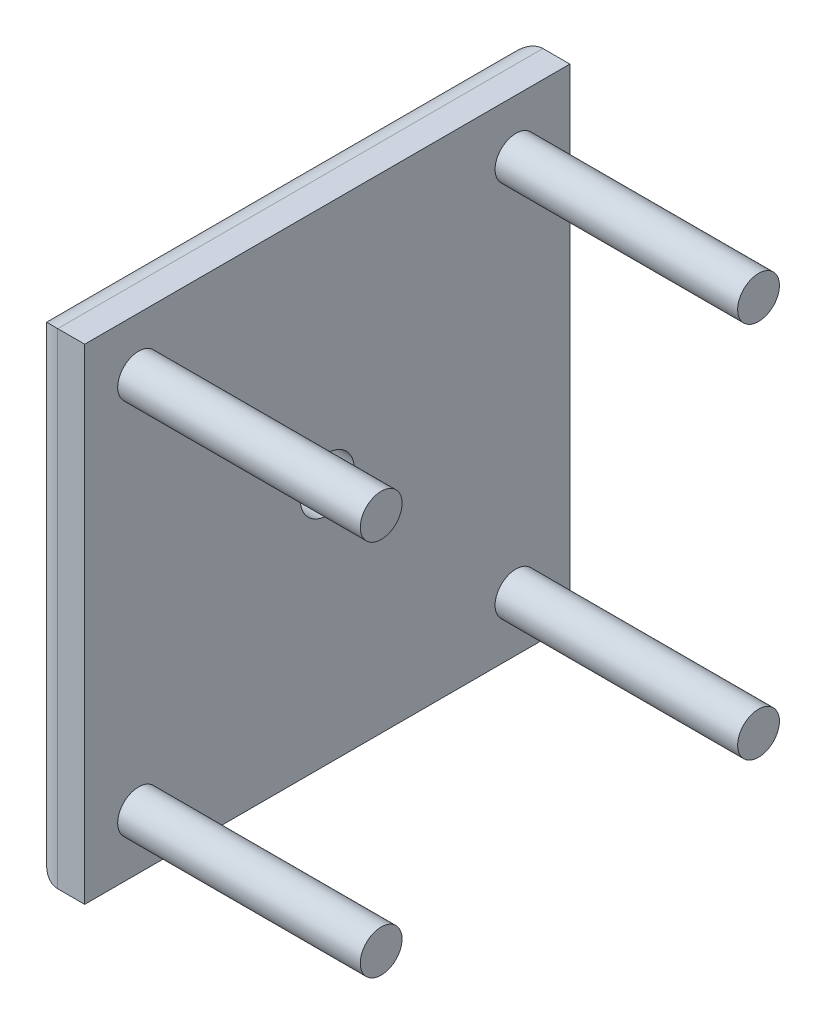
ISO-10303-21;
HEADER;
FILE_DESCRIPTION(('STEP AP214'),'2;1');
FILE_NAME('part.step','',(''),(''),'','','');
FILE_SCHEMA(('AUTOMOTIVE_DESIGN { 1 0 10303 214 1 1 1 1 }'));
ENDSEC;
DATA;
#1=APPLICATION_CONTEXT('core data for automotive mechanical design processes');
#2=APPLICATION_PROTOCOL_DEFINITION('international standard','automotive_design',2000,#1);
#3=PRODUCT_CONTEXT('',#1,'mechanical');
#4=PRODUCT('Part','Part','',(#3));
#5=PRODUCT_RELATED_PRODUCT_CATEGORY('part','',(#4));
#6=PRODUCT_DEFINITION_FORMATION('','',#4);
#7=PRODUCT_DEFINITION_CONTEXT('part definition',#1,'design');
#8=PRODUCT_DEFINITION('design','',#6,#7);
#9=PRODUCT_DEFINITION_SHAPE('','',#8);
#10=(LENGTH_UNIT() NAMED_UNIT(*) SI_UNIT(.MILLI.,.METRE.));
#11=(NAMED_UNIT(*) PLANE_ANGLE_UNIT() SI_UNIT($,.RADIAN.));
#12=(NAMED_UNIT(*) SI_UNIT($,.STERADIAN.) SOLID_ANGLE_UNIT());
#13=UNCERTAINTY_MEASURE_WITH_UNIT(LENGTH_MEASURE(1.E-05),#10,'distance_accuracy_value','');
#14=(GEOMETRIC_REPRESENTATION_CONTEXT(3) GLOBAL_UNCERTAINTY_ASSIGNED_CONTEXT((#13)) GLOBAL_UNIT_ASSIGNED_CONTEXT((#10,
#11,#12)) REPRESENTATION_CONTEXT('',''));
#15=CARTESIAN_POINT('',(0.,0.,0.));
#16=DIRECTION('',(0.,0.,1.));
#17=DIRECTION('',(1.,0.,0.));
#18=AXIS2_PLACEMENT_3D('',#15,#16,#17);
#19=CARTESIAN_POINT('',(2.,0.,0.));
#20=DIRECTION('',(1.,0.,0.));
#21=DIRECTION('',(0.,0.,-1.));
#22=AXIS2_PLACEMENT_3D('',#19,#20,#21);
#23=PLANE('',#22);
#24=CARTESIAN_POINT('',(2.,0.,0.));
#25=DIRECTION('',(1.,0.,0.));
#26=DIRECTION('',(0.,0.,-1.));
#27=AXIS2_PLACEMENT_3D('',#24,#25,#26);
#28=CIRCLE('',#27,1.);
#29=CARTESIAN_POINT('',(2.,0.,-1.));
#30=VERTEX_POINT('',#29);
#31=EDGE_CURVE('E220',#30,#30,#28,.T.);
#32=ORIENTED_EDGE('',*,*,#31,.F.);
#33=EDGE_LOOP('',(#32));
#34=FACE_BOUND('',#33,.T.);
#35=CARTESIAN_POINT('',(2.,7.,-7.));
#36=DIRECTION('',(1.,0.,0.));
#37=DIRECTION('',(0.,0.,-1.));
#38=AXIS2_PLACEMENT_3D('',#35,#36,#37);
#39=CIRCLE('',#38,0.775);
#40=CARTESIAN_POINT('',(2.,7.,-7.775));
#41=VERTEX_POINT('',#40);
#42=EDGE_CURVE('E229',#41,#41,#39,.T.);
#43=ORIENTED_EDGE('',*,*,#42,.F.);
#44=EDGE_LOOP('',(#43));
#45=FACE_BOUND('',#44,.T.);
#46=CARTESIAN_POINT('',(2.,-7.,7.));
#47=DIRECTION('',(1.,0.,0.));
#48=DIRECTION('',(0.,0.,-1.));
#49=AXIS2_PLACEMENT_3D('',#46,#47,#48);
#50=CIRCLE('',#49,0.775);
#51=CARTESIAN_POINT('',(2.,-7.,6.225));
#52=VERTEX_POINT('',#51);
#53=EDGE_CURVE('E237',#52,#52,#50,.T.);
#54=ORIENTED_EDGE('',*,*,#53,.F.);
#55=EDGE_LOOP('',(#54));
#56=FACE_BOUND('',#55,.T.);
#57=CARTESIAN_POINT('',(2.,-7.,-7.));
#58=DIRECTION('',(1.,0.,0.));
#59=DIRECTION('',(0.,0.,-1.));
#60=AXIS2_PLACEMENT_3D('',#57,#58,#59);
#61=CIRCLE('',#60,0.775);
#62=CARTESIAN_POINT('',(2.,-7.,-7.775));
#63=VERTEX_POINT('',#62);
#64=EDGE_CURVE('E245',#63,#63,#61,.T.);
#65=ORIENTED_EDGE('',*,*,#64,.F.);
#66=EDGE_LOOP('',(#65));
#67=FACE_BOUND('',#66,.T.);
#68=CARTESIAN_POINT('',(2.,7.,7.));
#69=DIRECTION('',(1.,0.,0.));
#70=DIRECTION('',(0.,0.,-1.));
#71=AXIS2_PLACEMENT_3D('',#68,#69,#70);
#72=CIRCLE('',#71,0.775);
#73=CARTESIAN_POINT('',(2.,7.,6.225));
#74=VERTEX_POINT('',#73);
#75=EDGE_CURVE('E249',#74,#74,#72,.T.);
#76=ORIENTED_EDGE('',*,*,#75,.F.);
#77=EDGE_LOOP('',(#76));
#78=FACE_BOUND('',#77,.T.);
#79=DIRECTION('',(0.,0.,-1.));
#80=VECTOR('',#79,1.);
#81=CARTESIAN_POINT('',(2.,-9.,0.));
#82=LINE('',#81,#80);
#83=CARTESIAN_POINT('',(2.,-9.,9.));
#84=VERTEX_POINT('',#83);
#85=CARTESIAN_POINT('',(2.,-9.,-9.));
#86=VERTEX_POINT('',#85);
#87=EDGE_CURVE('E158',#84,#86,#82,.T.);
#88=ORIENTED_EDGE('',*,*,#87,.T.);
#89=DIRECTION('',(0.,1.,0.));
#90=VECTOR('',#89,1.);
#91=CARTESIAN_POINT('',(2.,0.,-9.));
#92=LINE('',#91,#90);
#93=CARTESIAN_POINT('',(2.,9.,-9.));
#94=VERTEX_POINT('',#93);
#95=EDGE_CURVE('E147',#86,#94,#92,.T.);
#96=ORIENTED_EDGE('',*,*,#95,.T.);
#97=DIRECTION('',(0.,0.,-1.));
#98=VECTOR('',#97,1.);
#99=CARTESIAN_POINT('',(2.,9.,0.));
#100=LINE('',#99,#98);
#101=CARTESIAN_POINT('',(2.,9.,9.));
#102=VERTEX_POINT('',#101);
#103=EDGE_CURVE('E157',#102,#94,#100,.T.);
#104=ORIENTED_EDGE('',*,*,#103,.F.);
#105=DIRECTION('',(0.,1.,0.));
#106=VECTOR('',#105,1.);
#107=CARTESIAN_POINT('',(2.,0.,9.));
#108=LINE('',#107,#106);
#109=EDGE_CURVE('E163',#84,#102,#108,.T.);
#110=ORIENTED_EDGE('',*,*,#109,.F.);
#111=EDGE_LOOP('',(#88,#96,#104,#110));
#112=FACE_BOUND('',#111,.T.);
#113=ADVANCED_FACE('F95',(#34,#45,#56,#67,#78,#112),#23,.T.);
#114=CARTESIAN_POINT('',(0.,0.,0.));
#115=DIRECTION('',(1.,0.,0.));
#116=DIRECTION('',(0.,0.,-1.));
#117=AXIS2_PLACEMENT_3D('',#114,#115,#116);
#118=PLANE('',#117);
#119=DIRECTION('',(0.,1.,0.));
#120=VECTOR('',#119,1.);
#121=CARTESIAN_POINT('',(0.,0.,-8.));
#122=LINE('',#121,#120);
#123=CARTESIAN_POINT('',(0.,8.,-8.));
#124=VERTEX_POINT('',#123);
#125=CARTESIAN_POINT('',(0.,-8.,-8.));
#126=VERTEX_POINT('',#125);
#127=EDGE_CURVE('E185',#124,#126,#122,.F.);
#128=ORIENTED_EDGE('',*,*,#127,.T.);
#129=DIRECTION('',(0.,0.,-1.));
#130=VECTOR('',#129,1.);
#131=CARTESIAN_POINT('',(0.,-8.,0.));
#132=LINE('',#131,#130);
#133=CARTESIAN_POINT('',(0.,-8.,8.));
#134=VERTEX_POINT('',#133);
#135=EDGE_CURVE('E191',#126,#134,#132,.F.);
#136=ORIENTED_EDGE('',*,*,#135,.T.);
#137=DIRECTION('',(0.,1.,0.));
#138=VECTOR('',#137,1.);
#139=CARTESIAN_POINT('',(0.,9.,8.));
#140=LINE('',#139,#138);
#141=CARTESIAN_POINT('',(0.,8.,8.));
#142=VERTEX_POINT('',#141);
#143=EDGE_CURVE('E188',#134,#142,#140,.T.);
#144=ORIENTED_EDGE('',*,*,#143,.T.);
#145=DIRECTION('',(0.,0.,-1.));
#146=VECTOR('',#145,1.);
#147=CARTESIAN_POINT('',(0.,8.,-9.));
#148=LINE('',#147,#146);
#149=EDGE_CURVE('E177',#142,#124,#148,.T.);
#150=ORIENTED_EDGE('',*,*,#149,.T.);
#151=EDGE_LOOP('',(#128,#136,#144,#150));
#152=FACE_BOUND('',#151,.T.);
#153=CARTESIAN_POINT('',(0.,0.,0.));
#154=DIRECTION('',(-1.,0.,0.));
#155=DIRECTION('',(0.,0.,1.));
#156=AXIS2_PLACEMENT_3D('',#153,#154,#155);
#157=CIRCLE('',#156,1.);
#158=CARTESIAN_POINT('',(0.,0.,1.));
#159=VERTEX_POINT('',#158);
#160=EDGE_CURVE('E213',#159,#159,#157,.T.);
#161=ORIENTED_EDGE('',*,*,#160,.F.);
#162=EDGE_LOOP('',(#161));
#163=FACE_BOUND('',#162,.T.);
#164=ADVANCED_FACE('F284',(#152,#163),#118,.F.);
#165=CARTESIAN_POINT('',(2.,0.,-9.));
#166=DIRECTION('',(0.,0.,1.));
#167=DIRECTION('',(1.,0.,0.));
#168=AXIS2_PLACEMENT_3D('',#165,#166,#167);
#169=PLANE('',#168);
#170=DIRECTION('',(-1.,0.,0.));
#171=VECTOR('',#170,1.);
#172=CARTESIAN_POINT('',(2.,-9.,-9.));
#173=LINE('',#172,#171);
#174=CARTESIAN_POINT('',(1.,-9.,-9.));
#175=VERTEX_POINT('',#174);
#176=EDGE_CURVE('E151',#86,#175,#173,.T.);
#177=ORIENTED_EDGE('',*,*,#176,.T.);
#178=DIRECTION('',(0.,1.,0.));
#179=VECTOR('',#178,1.);
#180=CARTESIAN_POINT('',(1.,0.,-9.));
#181=LINE('',#180,#179);
#182=CARTESIAN_POINT('',(1.,9.,-9.));
#183=VERTEX_POINT('',#182);
#184=EDGE_CURVE('E105',#175,#183,#181,.T.);
#185=ORIENTED_EDGE('',*,*,#184,.T.);
#186=DIRECTION('',(-1.,0.,0.));
#187=VECTOR('',#186,1.);
#188=CARTESIAN_POINT('',(2.,9.,-9.));
#189=LINE('',#188,#187);
#190=EDGE_CURVE('E152',#94,#183,#189,.T.);
#191=ORIENTED_EDGE('',*,*,#190,.F.);
#192=ORIENTED_EDGE('',*,*,#95,.F.);
#193=EDGE_LOOP('',(#177,#185,#191,#192));
#194=FACE_BOUND('',#193,.T.);
#195=ADVANCED_FACE('F149',(#194),#169,.F.);
#196=CARTESIAN_POINT('',(2.,9.,0.));
#197=DIRECTION('',(0.,1.,0.));
#198=DIRECTION('',(0.,0.,1.));
#199=AXIS2_PLACEMENT_3D('',#196,#197,#198);
#200=PLANE('',#199);
#201=ORIENTED_EDGE('',*,*,#190,.T.);
#202=DIRECTION('',(0.,0.,-1.));
#203=VECTOR('',#202,1.);
#204=CARTESIAN_POINT('',(1.,9.,9.));
#205=LINE('',#204,#203);
#206=CARTESIAN_POINT('',(1.,9.,9.));
#207=VERTEX_POINT('',#206);
#208=EDGE_CURVE('E12',#183,#207,#205,.F.);
#209=ORIENTED_EDGE('',*,*,#208,.T.);
#210=DIRECTION('',(-1.,0.,0.));
#211=VECTOR('',#210,1.);
#212=CARTESIAN_POINT('',(2.,9.,9.));
#213=LINE('',#212,#211);
#214=EDGE_CURVE('E179',#102,#207,#213,.T.);
#215=ORIENTED_EDGE('',*,*,#214,.F.);
#216=ORIENTED_EDGE('',*,*,#103,.T.);
#217=EDGE_LOOP('',(#201,#209,#215,#216));
#218=FACE_BOUND('',#217,.T.);
#219=ADVANCED_FACE('F292',(#218),#200,.T.);
#220=CARTESIAN_POINT('',(2.,0.,9.));
#221=DIRECTION('',(0.,0.,1.));
#222=DIRECTION('',(1.,0.,0.));
#223=AXIS2_PLACEMENT_3D('',#220,#221,#222);
#224=PLANE('',#223);
#225=ORIENTED_EDGE('',*,*,#214,.T.);
#226=DIRECTION('',(0.,1.,0.));
#227=VECTOR('',#226,1.);
#228=CARTESIAN_POINT('',(1.,-9.,9.));
#229=LINE('',#228,#227);
#230=CARTESIAN_POINT('',(1.,-9.,9.));
#231=VERTEX_POINT('',#230);
#232=EDGE_CURVE('E195',#207,#231,#229,.F.);
#233=ORIENTED_EDGE('',*,*,#232,.T.);
#234=DIRECTION('',(-1.,0.,0.));
#235=VECTOR('',#234,1.);
#236=CARTESIAN_POINT('',(2.,-9.,9.));
#237=LINE('',#236,#235);
#238=EDGE_CURVE('E263',#84,#231,#237,.T.);
#239=ORIENTED_EDGE('',*,*,#238,.F.);
#240=ORIENTED_EDGE('',*,*,#109,.T.);
#241=EDGE_LOOP('',(#225,#233,#239,#240));
#242=FACE_BOUND('',#241,.T.);
#243=ADVANCED_FACE('F267',(#242),#224,.T.);
#244=CARTESIAN_POINT('',(2.,-9.,0.));
#245=DIRECTION('',(0.,1.,0.));
#246=DIRECTION('',(0.,0.,1.));
#247=AXIS2_PLACEMENT_3D('',#244,#245,#246);
#248=PLANE('',#247);
#249=ORIENTED_EDGE('',*,*,#238,.T.);
#250=DIRECTION('',(0.,0.,-1.));
#251=VECTOR('',#250,1.);
#252=CARTESIAN_POINT('',(1.,-9.,0.));
#253=LINE('',#252,#251);
#254=EDGE_CURVE('E172',#231,#175,#253,.T.);
#255=ORIENTED_EDGE('',*,*,#254,.T.);
#256=ORIENTED_EDGE('',*,*,#176,.F.);
#257=ORIENTED_EDGE('',*,*,#87,.F.);
#258=EDGE_LOOP('',(#249,#255,#256,#257));
#259=FACE_BOUND('',#258,.T.);
#260=ADVANCED_FACE('F170',(#259),#248,.F.);
#261=CARTESIAN_POINT('',(11.,7.,7.));
#262=DIRECTION('',(-1.,0.,0.));
#263=DIRECTION('',(0.,0.,1.));
#264=AXIS2_PLACEMENT_3D('',#261,#262,#263);
#265=CYLINDRICAL_SURFACE('',#264,0.775);
#266=CARTESIAN_POINT('',(11.,7.,7.));
#267=DIRECTION('',(1.,0.,0.));
#268=DIRECTION('',(0.,0.,-1.));
#269=AXIS2_PLACEMENT_3D('',#266,#267,#268);
#270=CIRCLE('',#269,0.775);
#271=CARTESIAN_POINT('',(11.,7.,6.225));
#272=VERTEX_POINT('',#271);
#273=EDGE_CURVE('E167',#272,#272,#270,.T.);
#274=ORIENTED_EDGE('',*,*,#273,.F.);
#275=EDGE_LOOP('',(#274));
#276=FACE_BOUND('',#275,.T.);
#277=ORIENTED_EDGE('',*,*,#75,.T.);
#278=EDGE_LOOP('',(#277));
#279=FACE_BOUND('',#278,.T.);
#280=ADVANCED_FACE('F296',(#276,#279),#265,.T.);
#281=CARTESIAN_POINT('',(11.,0.,0.));
#282=DIRECTION('',(1.,0.,0.));
#283=DIRECTION('',(0.,0.,-1.));
#284=AXIS2_PLACEMENT_3D('',#281,#282,#283);
#285=PLANE('',#284);
#286=ORIENTED_EDGE('',*,*,#273,.T.);
#287=EDGE_LOOP('',(#286));
#288=FACE_BOUND('',#287,.T.);
#289=ADVANCED_FACE('F308',(#288),#285,.T.);
#290=CARTESIAN_POINT('',(11.,-7.,-7.));
#291=DIRECTION('',(-1.,0.,0.));
#292=DIRECTION('',(0.,0.,1.));
#293=AXIS2_PLACEMENT_3D('',#290,#291,#292);
#294=CYLINDRICAL_SURFACE('',#293,0.775);
#295=CARTESIAN_POINT('',(11.,-7.,-7.));
#296=DIRECTION('',(1.,0.,0.));
#297=DIRECTION('',(0.,0.,-1.));
#298=AXIS2_PLACEMENT_3D('',#295,#296,#297);
#299=CIRCLE('',#298,0.775);
#300=CARTESIAN_POINT('',(11.,-7.,-7.775));
#301=VERTEX_POINT('',#300);
#302=EDGE_CURVE('E241',#301,#301,#299,.T.);
#303=ORIENTED_EDGE('',*,*,#302,.F.);
#304=EDGE_LOOP('',(#303));
#305=FACE_BOUND('',#304,.T.);
#306=ORIENTED_EDGE('',*,*,#64,.T.);
#307=EDGE_LOOP('',(#306));
#308=FACE_BOUND('',#307,.T.);
#309=ADVANCED_FACE('F313',(#305,#308),#294,.T.);
#310=CARTESIAN_POINT('',(11.,0.,0.));
#311=DIRECTION('',(1.,0.,0.));
#312=DIRECTION('',(0.,0.,-1.));
#313=AXIS2_PLACEMENT_3D('',#310,#311,#312);
#314=PLANE('',#313);
#315=ORIENTED_EDGE('',*,*,#302,.T.);
#316=EDGE_LOOP('',(#315));
#317=FACE_BOUND('',#316,.T.);
#318=ADVANCED_FACE('F319',(#317),#314,.T.);
#319=CARTESIAN_POINT('',(11.,-7.,7.));
#320=DIRECTION('',(-1.,0.,0.));
#321=DIRECTION('',(0.,0.,1.));
#322=AXIS2_PLACEMENT_3D('',#319,#320,#321);
#323=CYLINDRICAL_SURFACE('',#322,0.775);
#324=CARTESIAN_POINT('',(11.,-7.,7.));
#325=DIRECTION('',(1.,0.,0.));
#326=DIRECTION('',(0.,0.,-1.));
#327=AXIS2_PLACEMENT_3D('',#324,#325,#326);
#328=CIRCLE('',#327,0.775);
#329=CARTESIAN_POINT('',(11.,-7.,6.225));
#330=VERTEX_POINT('',#329);
#331=EDGE_CURVE('E233',#330,#330,#328,.T.);
#332=ORIENTED_EDGE('',*,*,#331,.F.);
#333=EDGE_LOOP('',(#332));
#334=FACE_BOUND('',#333,.T.);
#335=ORIENTED_EDGE('',*,*,#53,.T.);
#336=EDGE_LOOP('',(#335));
#337=FACE_BOUND('',#336,.T.);
#338=ADVANCED_FACE('F322',(#334,#337),#323,.T.);
#339=CARTESIAN_POINT('',(11.,0.,0.));
#340=DIRECTION('',(1.,0.,0.));
#341=DIRECTION('',(0.,0.,-1.));
#342=AXIS2_PLACEMENT_3D('',#339,#340,#341);
#343=PLANE('',#342);
#344=ORIENTED_EDGE('',*,*,#331,.T.);
#345=EDGE_LOOP('',(#344));
#346=FACE_BOUND('',#345,.T.);
#347=ADVANCED_FACE('F327',(#346),#343,.T.);
#348=CARTESIAN_POINT('',(11.,7.,-7.));
#349=DIRECTION('',(-1.,0.,0.));
#350=DIRECTION('',(0.,0.,1.));
#351=AXIS2_PLACEMENT_3D('',#348,#349,#350);
#352=CYLINDRICAL_SURFACE('',#351,0.775);
#353=CARTESIAN_POINT('',(11.,7.,-7.));
#354=DIRECTION('',(1.,0.,0.));
#355=DIRECTION('',(0.,0.,-1.));
#356=AXIS2_PLACEMENT_3D('',#353,#354,#355);
#357=CIRCLE('',#356,0.775);
#358=CARTESIAN_POINT('',(11.,7.,-7.775));
#359=VERTEX_POINT('',#358);
#360=EDGE_CURVE('E226',#359,#359,#357,.T.);
#361=ORIENTED_EDGE('',*,*,#360,.F.);
#362=EDGE_LOOP('',(#361));
#363=FACE_BOUND('',#362,.T.);
#364=ORIENTED_EDGE('',*,*,#42,.T.);
#365=EDGE_LOOP('',(#364));
#366=FACE_BOUND('',#365,.T.);
#367=ADVANCED_FACE('F330',(#363,#366),#352,.T.);
#368=CARTESIAN_POINT('',(11.,7.,-7.));
#369=DIRECTION('',(1.,0.,0.));
#370=DIRECTION('',(0.,0.,-1.));
#371=AXIS2_PLACEMENT_3D('',#368,#369,#370);
#372=PLANE('',#371);
#373=ORIENTED_EDGE('',*,*,#360,.T.);
#374=EDGE_LOOP('',(#373));
#375=FACE_BOUND('',#374,.T.);
#376=ADVANCED_FACE('F335',(#375),#372,.T.);
#377=CARTESIAN_POINT('',(9.,0.,0.));
#378=DIRECTION('',(-1.,0.,0.));
#379=DIRECTION('',(0.,0.,1.));
#380=AXIS2_PLACEMENT_3D('',#377,#378,#379);
#381=CYLINDRICAL_SURFACE('',#380,1.);
#382=ORIENTED_EDGE('',*,*,#31,.T.);
#383=EDGE_LOOP('',(#382));
#384=FACE_BOUND('',#383,.T.);
#385=ORIENTED_EDGE('',*,*,#160,.T.);
#386=EDGE_LOOP('',(#385));
#387=FACE_BOUND('',#386,.T.);
#388=ADVANCED_FACE('F338',(#384,#387),#381,.F.);
#389=CARTESIAN_POINT('',(1.,8.,0.));
#390=DIRECTION('',(0.,0.,1.));
#391=DIRECTION('',(1.,0.,0.));
#392=AXIS2_PLACEMENT_3D('',#389,#390,#391);
#393=CYLINDRICAL_SURFACE('',#392,1.);
#394=CARTESIAN_POINT('',(1.,8.,-8.));
#395=DIRECTION('',(0.,0.707106781186547,0.707106781186547));
#396=DIRECTION('',(0.,-0.707106781186547,0.707106781186547));
#397=AXIS2_PLACEMENT_3D('',#394,#395,#396);
#398=ELLIPSE('',#397,1.41421356237309,1.);
#399=EDGE_CURVE('E205',#124,#183,#398,.F.);
#400=ORIENTED_EDGE('',*,*,#399,.F.);
#401=ORIENTED_EDGE('',*,*,#149,.F.);
#402=CARTESIAN_POINT('',(1.,8.,8.));
#403=DIRECTION('',(0.,-0.707106781186547,0.707106781186547));
#404=DIRECTION('',(0.,0.707106781186547,0.707106781186547));
#405=AXIS2_PLACEMENT_3D('',#402,#403,#404);
#406=ELLIPSE('',#405,1.41421356237309,1.);
#407=EDGE_CURVE('E99',#207,#142,#406,.T.);
#408=ORIENTED_EDGE('',*,*,#407,.F.);
#409=ORIENTED_EDGE('',*,*,#208,.F.);
#410=EDGE_LOOP('',(#400,#401,#408,#409));
#411=FACE_BOUND('',#410,.T.);
#412=ADVANCED_FACE('F97',(#411),#393,.T.);
#413=CARTESIAN_POINT('',(1.,0.,8.));
#414=DIRECTION('',(0.,-1.,0.));
#415=DIRECTION('',(0.,0.,-1.));
#416=AXIS2_PLACEMENT_3D('',#413,#414,#415);
#417=CYLINDRICAL_SURFACE('',#416,1.);
#418=ORIENTED_EDGE('',*,*,#407,.T.);
#419=ORIENTED_EDGE('',*,*,#143,.F.);
#420=CARTESIAN_POINT('',(1.,-8.,8.));
#421=DIRECTION('',(0.,-0.707106781186547,-0.707106781186547));
#422=DIRECTION('',(0.,-0.707106781186547,0.707106781186547));
#423=AXIS2_PLACEMENT_3D('',#420,#421,#422);
#424=ELLIPSE('',#423,1.41421356237309,1.);
#425=EDGE_CURVE('E203',#231,#134,#424,.T.);
#426=ORIENTED_EDGE('',*,*,#425,.F.);
#427=ORIENTED_EDGE('',*,*,#232,.F.);
#428=EDGE_LOOP('',(#418,#419,#426,#427));
#429=FACE_BOUND('',#428,.T.);
#430=ADVANCED_FACE('F271',(#429),#417,.T.);
#431=CARTESIAN_POINT('',(1.,0.,-8.));
#432=DIRECTION('',(0.,1.,0.));
#433=DIRECTION('',(0.,0.,1.));
#434=AXIS2_PLACEMENT_3D('',#431,#432,#433);
#435=CYLINDRICAL_SURFACE('',#434,1.);
#436=ORIENTED_EDGE('',*,*,#399,.T.);
#437=ORIENTED_EDGE('',*,*,#184,.F.);
#438=CARTESIAN_POINT('',(1.,-8.,-8.));
#439=DIRECTION('',(0.,0.707106781186547,-0.707106781186547));
#440=DIRECTION('',(0.,0.707106781186547,0.707106781186547));
#441=AXIS2_PLACEMENT_3D('',#438,#439,#440);
#442=ELLIPSE('',#441,1.41421356237309,1.);
#443=EDGE_CURVE('E200',#126,#175,#442,.F.);
#444=ORIENTED_EDGE('',*,*,#443,.F.);
#445=ORIENTED_EDGE('',*,*,#127,.F.);
#446=EDGE_LOOP('',(#436,#437,#444,#445));
#447=FACE_BOUND('',#446,.T.);
#448=ADVANCED_FACE('F276',(#447),#435,.T.);
#449=CARTESIAN_POINT('',(1.,-8.,0.));
#450=DIRECTION('',(0.,0.,-1.));
#451=DIRECTION('',(-1.,0.,0.));
#452=AXIS2_PLACEMENT_3D('',#449,#450,#451);
#453=CYLINDRICAL_SURFACE('',#452,1.);
#454=ORIENTED_EDGE('',*,*,#425,.T.);
#455=ORIENTED_EDGE('',*,*,#135,.F.);
#456=ORIENTED_EDGE('',*,*,#443,.T.);
#457=ORIENTED_EDGE('',*,*,#254,.F.);
#458=EDGE_LOOP('',(#454,#455,#456,#457));
#459=FACE_BOUND('',#458,.T.);
#460=ADVANCED_FACE('F274',(#459),#453,.T.);
#461=CLOSED_SHELL('',(#113,#164,#195,#219,#243,#260,#280,#289,#309,#318,#338,#347,#367,#376,
#388,#412,#430,#448,#460));
#462=MANIFOLD_SOLID_BREP('B2',#461);
#463=ADVANCED_BREP_SHAPE_REPRESENTATION('',(#18,#462),#14);
#464=SHAPE_DEFINITION_REPRESENTATION(#9,#463);
ENDSEC;
END-ISO-10303-21;
